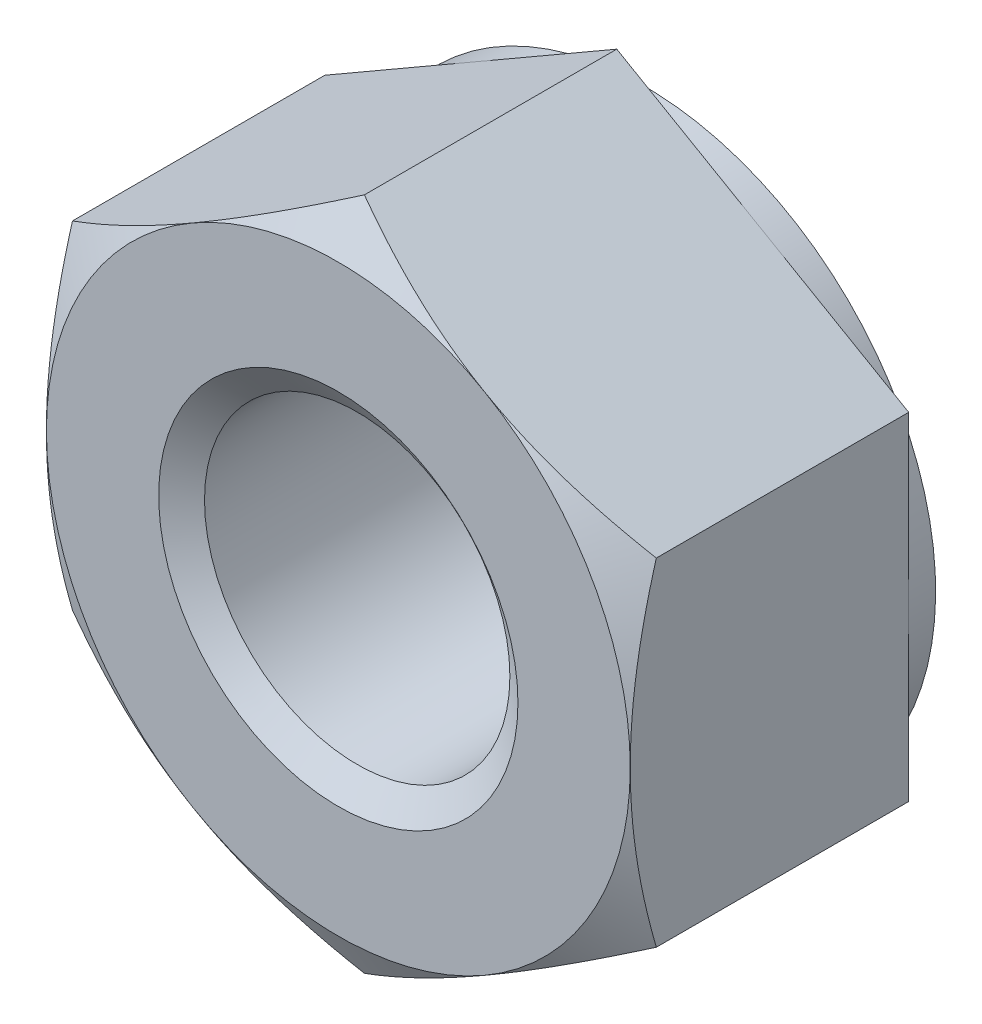
ISO-10303-21;
HEADER;
FILE_DESCRIPTION(('STEP AP214'),'2;1');
FILE_NAME('part.step','',(''),(''),'','','');
FILE_SCHEMA(('AUTOMOTIVE_DESIGN { 1 0 10303 214 1 1 1 1 }'));
ENDSEC;
DATA;
#1=APPLICATION_CONTEXT('core data for automotive mechanical design processes');
#2=APPLICATION_PROTOCOL_DEFINITION('international standard','automotive_design',2000,#1);
#3=PRODUCT_CONTEXT('',#1,'mechanical');
#4=PRODUCT('Part','Part','',(#3));
#5=PRODUCT_RELATED_PRODUCT_CATEGORY('part','',(#4));
#6=PRODUCT_DEFINITION_FORMATION('','',#4);
#7=PRODUCT_DEFINITION_CONTEXT('part definition',#1,'design');
#8=PRODUCT_DEFINITION('design','',#6,#7);
#9=PRODUCT_DEFINITION_SHAPE('','',#8);
#10=(LENGTH_UNIT() NAMED_UNIT(*) SI_UNIT(.MILLI.,.METRE.));
#11=(NAMED_UNIT(*) PLANE_ANGLE_UNIT() SI_UNIT($,.RADIAN.));
#12=(NAMED_UNIT(*) SI_UNIT($,.STERADIAN.) SOLID_ANGLE_UNIT());
#13=UNCERTAINTY_MEASURE_WITH_UNIT(LENGTH_MEASURE(1.E-05),#10,'distance_accuracy_value','');
#14=(GEOMETRIC_REPRESENTATION_CONTEXT(3) GLOBAL_UNCERTAINTY_ASSIGNED_CONTEXT((#13)) GLOBAL_UNIT_ASSIGNED_CONTEXT((#10,
#11,#12)) REPRESENTATION_CONTEXT('',''));
#15=CARTESIAN_POINT('',(0.,0.,0.));
#16=DIRECTION('',(0.,0.,1.));
#17=DIRECTION('',(1.,0.,0.));
#18=AXIS2_PLACEMENT_3D('',#15,#16,#17);
#19=CARTESIAN_POINT('',(0.,0.,0.));
#20=DIRECTION('',(0.,0.,-1.));
#21=DIRECTION('',(-1.,0.,0.));
#22=AXIS2_PLACEMENT_3D('',#19,#20,#21);
#23=CONICAL_SURFACE('',#22,6.5,1.04719755107477);
#24=CARTESIAN_POINT('',(4.72863531421646E-10,7.50555349906876,-0.580556583193494));
#25=CARTESIAN_POINT('',(0.264548615546439,7.35281628474972,-0.492351588834491));
#26=CARTESIAN_POINT('',(0.5312158310392,7.1988558960428,-0.411540414424662));
#27=CARTESIAN_POINT('',(1.06690090720306,6.88957797311685,-0.269031363292441));
#28=CARTESIAN_POINT('',(1.33590008269548,6.73427122679019,-0.207238975469958));
#29=CARTESIAN_POINT('',(1.74193754529687,6.49984538851051,-0.131368414223829));
#30=CARTESIAN_POINT('',(1.87779627836775,6.4214073124135,-0.108872020403068));
#31=CARTESIAN_POINT('',(2.15016415564433,6.26415564517842,-0.0699302937485192));
#32=CARTESIAN_POINT('',(2.28667328263536,6.18534206397925,-0.0534848016504085));
#33=CARTESIAN_POINT('',(2.56084687811666,6.02704786485477,-0.026933825458331));
#34=CARTESIAN_POINT('',(2.69851370632447,5.94756588454591,-0.016860583005697));
#35=CARTESIAN_POINT('',(2.97411810880389,5.78844560861542,-0.00337972757347202));
#36=CARTESIAN_POINT('',(3.11205573128343,5.70880728516091,2.65652992963238E-05));
#37=CARTESIAN_POINT('',(3.24999999900629,5.62916512507372,4.94253992282222E-11));
#38=B_SPLINE_CURVE_WITH_KNOTS('',3,(#24,#25,#26,#27,#28,#29,#30,#31,#32,#33,#34,#35,#36,#37),
.UNSPECIFIED.,.F.,.F.,(4,2,2,2,2,2,4),(0.,0.954247655457721,1.90367376124825,2.37900973690727,
2.8543332004677,3.33204281471727,3.80984700954534),.UNSPECIFIED.);
#39=CARTESIAN_POINT('',(0.,7.50555349878662,-0.580556583372366));
#40=VERTEX_POINT('',#39);
#41=CARTESIAN_POINT('',(3.24999999863401,5.62916512533808,0.));
#42=VERTEX_POINT('',#41);
#43=EDGE_CURVE('E20',#40,#42,#38,.T.);
#44=ORIENTED_EDGE('',*,*,#43,.F.);
#45=CARTESIAN_POINT('',(-3.2499999998115,5.62916512452829,9.15524602655434E-12));
#46=CARTESIAN_POINT('',(-3.11205573207291,5.70880728467641,2.65652986998172E-05));
#47=CARTESIAN_POINT('',(-2.97411810956437,5.78844560816871,-0.00337972755170862));
#48=CARTESIAN_POINT('',(-2.69851370701593,5.94756588415433,-0.0168605829565167));
#49=CARTESIAN_POINT('',(-2.56084687876808,6.02704786448052,-0.0269338254040609));
#50=CARTESIAN_POINT('',(-2.2866732832117,6.18534206364465,-0.0534848015858089));
#51=CARTESIAN_POINT('',(-2.15016415618561,6.26415564486611,-0.0699302936786051));
#52=CARTESIAN_POINT('',(-1.87779627883712,6.42140731214231,-0.108872020328481));
#53=CARTESIAN_POINT('',(-1.7419375457294,6.49984538825814,-0.131368414149898));
#54=CARTESIAN_POINT('',(-1.33590008302143,6.73427122660728,-0.207238975395306));
#55=CARTESIAN_POINT('',(-1.06690090746457,6.88957797299671,-0.269031363213585));
#56=CARTESIAN_POINT('',(-0.531215831135039,7.19885589595647,-0.411540414408486));
#57=CARTESIAN_POINT('',(-0.264548615540918,7.35281628463394,-0.492351588885751));
#58=CARTESIAN_POINT('',(-3.24874070537208E-10,7.50555349881243,-0.580556583387272));
#59=B_SPLINE_CURVE_WITH_KNOTS('',3,(#45,#46,#47,#48,#49,#50,#51,#52,#53,#54,#55,#56,#57,#58),
.UNSPECIFIED.,.F.,.F.,(4,2,2,2,2,2,4),(0.,0.47780419495855,0.955513809336461,1.43083727301903,
1.90617324880125,2.8555993548429,3.80984701056299),.UNSPECIFIED.);
#60=CARTESIAN_POINT('',(-3.25000000029403,5.62916512437967,0.));
#61=VERTEX_POINT('',#60);
#62=EDGE_CURVE('E107',#61,#40,#59,.T.);
#63=ORIENTED_EDGE('',*,*,#62,.F.);
#64=CARTESIAN_POINT('',(0.,0.,0.));
#65=DIRECTION('',(0.,0.,-1.));
#66=DIRECTION('',(-1.,0.,0.));
#67=AXIS2_PLACEMENT_3D('',#64,#65,#66);
#68=CIRCLE('',#67,6.5);
#69=EDGE_CURVE('E123',#61,#42,#68,.T.);
#70=ORIENTED_EDGE('',*,*,#69,.T.);
#71=EDGE_LOOP('',(#44,#63,#70));
#72=FACE_BOUND('',#71,.T.);
#73=ADVANCED_FACE('F16',(#72),#23,.T.);
#74=CARTESIAN_POINT('',(0.,0.,0.));
#75=DIRECTION('',(0.,0.,-1.));
#76=DIRECTION('',(-1.,0.,0.));
#77=AXIS2_PLACEMENT_3D('',#74,#75,#76);
#78=CONICAL_SURFACE('',#77,6.5,1.04719755107477);
#79=CARTESIAN_POINT('',(6.5,-6.66585222058023E-10,0.));
#80=CARTESIAN_POINT('',(6.5,0.159284319627088,2.65652672481863E-05));
#81=CARTESIAN_POINT('',(6.5,0.318560966655202,-0.00337972759246635));
#82=CARTESIAN_POINT('',(6.5,0.636801518754078,-0.0168605830067705));
#83=CARTESIAN_POINT('',(6.5,0.795765479490584,-0.0269338254545169));
#84=CARTESIAN_POINT('',(6.5,1.11235387797528,-0.0534848016443852));
#85=CARTESIAN_POINT('',(6.5,1.26998104049059,-0.0699302937450579));
#86=CARTESIAN_POINT('',(6.5,1.58448437518977,-0.108872020413472));
#87=CARTESIAN_POINT('',(6.5,1.74136052749585,-0.131368414245547));
#88=CARTESIAN_POINT('',(6.5,2.21021220441574,-0.207238975528109));
#89=CARTESIAN_POINT('',(6.5,2.52082569733984,-0.269031363378032));
#90=CARTESIAN_POINT('',(6.5,3.1393815435474,-0.411540414645797));
#91=CARTESIAN_POINT('',(6.5,3.4473023210451,-0.49235158916435));
#92=CARTESIAN_POINT('',(6.5,3.75277674954389,-0.580556583709641));
#93=B_SPLINE_CURVE_WITH_KNOTS('',3,(#79,#80,#81,#82,#83,#84,#85,#86,#87,#88,#89,#90,#91,#92),
.UNSPECIFIED.,.F.,.F.,(4,2,2,2,2,2,4),(0.,0.477804195114805,0.955513809649688,1.43083727348822,
1.90617324942611,2.85559935578021,3.80984701181537),.UNSPECIFIED.);
#94=CARTESIAN_POINT('',(6.5,-1.33317084205972E-09,0.));
#95=VERTEX_POINT('',#94);
#96=CARTESIAN_POINT('',(6.49999999977531,3.75277675012972,-0.580556583766414));
#97=VERTEX_POINT('',#96);
#98=EDGE_CURVE('E362',#95,#97,#93,.T.);
#99=ORIENTED_EDGE('',*,*,#98,.T.);
#100=CARTESIAN_POINT('',(3.24999999898149,5.6291651250075,9.15580939452926E-12));
#101=CARTESIAN_POINT('',(3.38794426681133,5.54952296490994,2.65653003698925E-05));
#102=CARTESIAN_POINT('',(3.52588188938477,5.46988464142251,-0.0033797275507208));
#103=CARTESIAN_POINT('',(3.80148629203953,5.31076436540649,-0.0168605829613687));
#104=CARTESIAN_POINT('',(3.93915312032881,5.23128238504503,-0.0269338254140679));
#105=CARTESIAN_POINT('',(4.2133267159733,5.07298818582176,-0.0534848016103036));
#106=CARTESIAN_POINT('',(4.34983584304605,4.99417460457635,-0.0699302937123955));
#107=CARTESIAN_POINT('',(4.62220372048568,4.8369229372498,-0.108872020384617));
#108=CARTESIAN_POINT('',(4.7580624536379,4.75848486110756,-0.131368414219083));
#109=CARTESIAN_POINT('',(5.16409991647828,4.52405902268074,-0.207238975508414));
#110=CARTESIAN_POINT('',(5.43309909212247,4.3687522762413,-0.269031363362396));
#111=CARTESIAN_POINT('',(5.96878416862515,4.0594743531824,-0.411540414638041));
#112=CARTESIAN_POINT('',(6.23545138430506,3.90551396445582,-0.492351589160441));
#113=CARTESIAN_POINT('',(6.49999999960499,3.75277675022806,-0.580556583709641));
#114=B_SPLINE_CURVE_WITH_KNOTS('',3,(#100,#101,#102,#103,#104,#105,#106,#107,#108,#109,#110,
#111,#112,#113),.UNSPECIFIED.,.F.,.F.,(4,2,2,2,2,2,4),(0.,0.477804195119742,0.955513809658695,
1.43083727350033,1.90617324944163,2.85559935579982,3.80984701184049),.UNSPECIFIED.);
#115=EDGE_CURVE('E126',#42,#97,#114,.T.);
#116=ORIENTED_EDGE('',*,*,#115,.F.);
#117=CARTESIAN_POINT('',(0.,0.,0.));
#118=DIRECTION('',(0.,0.,-1.));
#119=DIRECTION('',(-1.,0.,0.));
#120=AXIS2_PLACEMENT_3D('',#117,#118,#119);
#121=CIRCLE('',#120,6.5);
#122=EDGE_CURVE('E197',#42,#95,#121,.T.);
#123=ORIENTED_EDGE('',*,*,#122,.T.);
#124=EDGE_LOOP('',(#99,#116,#123));
#125=FACE_BOUND('',#124,.T.);
#126=ADVANCED_FACE('F373',(#125),#78,.T.);
#127=CARTESIAN_POINT('',(0.,0.,0.));
#128=DIRECTION('',(0.,0.,-1.));
#129=DIRECTION('',(-1.,0.,0.));
#130=AXIS2_PLACEMENT_3D('',#127,#128,#129);
#131=CONICAL_SURFACE('',#130,6.5,1.04719755107477);
#132=CARTESIAN_POINT('',(0.,0.,0.));
#133=DIRECTION('',(0.,0.,-1.));
#134=DIRECTION('',(-1.,0.,0.));
#135=AXIS2_PLACEMENT_3D('',#132,#133,#134);
#136=CIRCLE('',#135,6.5);
#137=CARTESIAN_POINT('',(3.24999999913947,-5.62916512504625,0.));
#138=VERTEX_POINT('',#137);
#139=EDGE_CURVE('E194',#95,#138,#136,.T.);
#140=ORIENTED_EDGE('',*,*,#139,.T.);
#141=CARTESIAN_POINT('',(6.49999999978493,-3.75277675053972,-0.580556583474029));
#142=CARTESIAN_POINT('',(6.23545138436271,-3.90551396456727,-0.4923515890777));
#143=CARTESIAN_POINT('',(5.96878416865135,-4.05947435320501,-0.411540414620386));
#144=CARTESIAN_POINT('',(5.4330990921604,-4.36875227618186,-0.26903136339699));
#145=CARTESIAN_POINT('',(5.16409991655898,-4.52405902262764,-0.207238975530734));
#146=CARTESIAN_POINT('',(4.75806245376185,-4.75848486103925,-0.131368414238618));
#147=CARTESIAN_POINT('',(4.62220372062005,-4.83692293717259,-0.108872020405778));
#148=CARTESIAN_POINT('',(4.34983584320351,-4.99417460448508,-0.0699302937329592));
#149=CARTESIAN_POINT('',(4.21332671614346,-5.07298818572532,-0.0534848016286592));
#150=CARTESIAN_POINT('',(3.93915312052231,-5.23128238493151,-0.0269338254309245));
#151=CARTESIAN_POINT('',(3.80148629224366,-5.31076436528102,-0.0168605829788777));
#152=CARTESIAN_POINT('',(3.52588188962263,-5.46988464129279,-0.00337972755480697));
#153=CARTESIAN_POINT('',(3.38794426707229,-5.54952296478793,2.65653103948823E-05));
#154=CARTESIAN_POINT('',(3.24999999927916,-5.62916512491618,4.94256495671794E-11));
#155=B_SPLINE_CURVE_WITH_KNOTS('',3,(#141,#142,#143,#144,#145,#146,#147,#148,#149,#150,#151,
#152,#153,#154),.UNSPECIFIED.,.F.,.F.,(4,2,2,2,2,2,4),(0.,0.954247655941806,1.90367376221062,
2.3790097381109,2.85433320191272,3.33204281640647,3.80984701147863),.UNSPECIFIED.);
#156=CARTESIAN_POINT('',(6.5,-3.75277674974055,-0.580556583766414));
#157=VERTEX_POINT('',#156);
#158=EDGE_CURVE('E209',#157,#138,#155,.T.);
#159=ORIENTED_EDGE('',*,*,#158,.F.);
#160=CARTESIAN_POINT('',(6.50000000035988,-3.75277674954389,-0.580556583474028));
#161=CARTESIAN_POINT('',(6.50000000012571,-3.44730232112239,-0.492351589105453));
#162=CARTESIAN_POINT('',(6.50000000003286,-3.13938154372647,-0.411540414672083));
#163=CARTESIAN_POINT('',(6.49999999996731,-2.52082569774051,-0.269031363485257));
#164=CARTESIAN_POINT('',(6.49999999999401,-2.21021220493605,-0.207238975631746));
#165=CARTESIAN_POINT('',(6.500000000003,-1.74136052819076,-0.131368414348256));
#166=CARTESIAN_POINT('',(6.50000000000081,-1.58448437594133,-0.108872020516548));
#167=CARTESIAN_POINT('',(6.49999999999919,-1.2699810413558,-0.0699302938421731));
#168=CARTESIAN_POINT('',(6.49999999999977,-1.11235387889749,-0.0534848017351855));
#169=CARTESIAN_POINT('',(6.50000000000023,-0.795765480528815,-0.0269338255280878));
#170=CARTESIAN_POINT('',(6.50000000000012,-0.636801519851326,-0.0168605830693242));
#171=CARTESIAN_POINT('',(6.49999999999988,-0.318560967870554,-0.00337972762777078));
#172=CARTESIAN_POINT('',(6.49999999999977,-0.159284320901526,2.6565248198344E-05));
#173=CARTESIAN_POINT('',(6.5,-6.66584706543692E-10,0.));
#174=B_SPLINE_CURVE_WITH_KNOTS('',3,(#160,#161,#162,#163,#164,#165,#166,#167,#168,#169,#170,
#171,#172,#173),.UNSPECIFIED.,.F.,.F.,(4,2,2,2,2,2,4),(0.,0.954247655676356,1.90367376168427,
2.37900973745345,2.85433320112418,3.33204281548458,3.80984701042333),.UNSPECIFIED.);
#175=EDGE_CURVE('E360',#157,#95,#174,.T.);
#176=ORIENTED_EDGE('',*,*,#175,.T.);
#177=EDGE_LOOP('',(#140,#159,#176));
#178=FACE_BOUND('',#177,.T.);
#179=ADVANCED_FACE('F376',(#178),#131,.T.);
#180=CARTESIAN_POINT('',(0.,0.,0.));
#181=DIRECTION('',(0.,0.,-1.));
#182=DIRECTION('',(-1.,0.,0.));
#183=AXIS2_PLACEMENT_3D('',#180,#181,#182);
#184=CONICAL_SURFACE('',#183,6.5,1.04719755107477);
#185=CARTESIAN_POINT('',(-4.72863354977161E-10,-7.50555349906876,-0.580556583193494));
#186=CARTESIAN_POINT('',(-0.264548615592853,-7.35281628472292,-0.492351588818976));
#187=CARTESIAN_POINT('',(-0.531215831132874,-7.19885589598872,-0.411540414396251));
#188=CARTESIAN_POINT('',(-1.06690090739167,-6.88957797300796,-0.269031363245728));
#189=CARTESIAN_POINT('',(-1.33590008293174,-6.73427122665379,-0.207238975417761));
#190=CARTESIAN_POINT('',(-1.74193754560532,-6.49984538833243,-0.13136841417023));
#191=CARTESIAN_POINT('',(-1.87779627870043,-6.42140731222143,-0.108872020350138));
#192=CARTESIAN_POINT('',(-2.15016415602557,-6.26415564495832,-0.0699302936993767));
#193=CARTESIAN_POINT('',(-2.28667328304091,-6.1853420637451,-0.0534848016043853));
#194=CARTESIAN_POINT('',(-2.56084687857123,-6.02704786459232,-0.0269338254210813));
#195=CARTESIAN_POINT('',(-2.69851370680374,-5.94756588426921,-0.0168605829741285));
#196=CARTESIAN_POINT('',(-2.97411810933234,-5.78844560831031,-0.00337972755580105));
#197=CARTESIAN_POINT('',(-3.11205573183639,-5.70880728484166,2.65653087502397E-05));
#198=CARTESIAN_POINT('',(-3.24999999958357,-5.62916512474042,4.94255243812087E-11));
#199=B_SPLINE_CURVE_WITH_KNOTS('',3,(#185,#186,#187,#188,#189,#190,#191,#192,#193,#194,#195,
#196,#197,#198),.UNSPECIFIED.,.F.,.F.,(4,2,2,2,2,2,4),(0.,0.954247655625393,1.90367376158064,
2.3790097373224,2.85433320096558,3.33204281529936,3.80984701021167),.UNSPECIFIED.);
#200=CARTESIAN_POINT('',(0.,-7.50555349878662,-0.580556583372366));
#201=VERTEX_POINT('',#200);
#202=CARTESIAN_POINT('',(-3.24999999978857,-5.6291651246715,0.));
#203=VERTEX_POINT('',#202);
#204=EDGE_CURVE('E330',#201,#203,#199,.T.);
#205=ORIENTED_EDGE('',*,*,#204,.F.);
#206=CARTESIAN_POINT('',(3.24999999923422,-5.62916512486158,9.15524602655464E-12));
#207=CARTESIAN_POINT('',(3.11205573151995,-5.70880728499566,2.6565289246409E-05));
#208=CARTESIAN_POINT('',(2.97411810903592,-5.78844560847382,-0.00337972756937895));
#209=CARTESIAN_POINT('',(2.69851370653667,-5.94756588443104,-0.0168605829880846));
#210=CARTESIAN_POINT('',(2.56084687831351,-6.02704786474297,-0.0269338254413101));
#211=CARTESIAN_POINT('',(2.28667328280615,-6.1853420638788,-0.053484801631832));
#212=CARTESIAN_POINT('',(2.15016415580438,-6.26415564508622,-0.0699302937277478));
#213=CARTESIAN_POINT('',(1.87779627850445,-6.42140731233438,-0.108872020381412));
#214=CARTESIAN_POINT('',(1.74193754542095,-6.49984538843622,-0.131368414203497));
#215=CARTESIAN_POINT('',(1.33590008278517,-6.73427122674369,-0.207238975447504));
#216=CARTESIAN_POINT('',(1.06690090727597,-6.8895779731056,-0.269031363260299));
#217=CARTESIAN_POINT('',(0.531215831041365,-7.19885589601056,-0.411540414436897));
#218=CARTESIAN_POINT('',(0.264548615494504,-7.35281628466074,-0.492351588901266));
#219=CARTESIAN_POINT('',(3.24874030728297E-10,-7.50555349881243,-0.580556583387272));
#220=B_SPLINE_CURVE_WITH_KNOTS('',3,(#206,#207,#208,#209,#210,#211,#212,#213,#214,#215,#216,
#217,#218,#219),.UNSPECIFIED.,.F.,.F.,(4,2,2,2,2,2,4),(0.,0.477804194874306,0.955513809168008,
1.43083727276783,1.90617324846731,2.85559935434424,3.80984700989666),.UNSPECIFIED.);
#221=EDGE_CURVE('E202',#138,#201,#220,.T.);
#222=ORIENTED_EDGE('',*,*,#221,.F.);
#223=CARTESIAN_POINT('',(0.,0.,0.));
#224=DIRECTION('',(0.,0.,-1.));
#225=DIRECTION('',(-1.,0.,0.));
#226=AXIS2_PLACEMENT_3D('',#223,#224,#225);
#227=CIRCLE('',#226,6.5);
#228=EDGE_CURVE('E191',#138,#203,#227,.T.);
#229=ORIENTED_EDGE('',*,*,#228,.T.);
#230=EDGE_LOOP('',(#205,#222,#229));
#231=FACE_BOUND('',#230,.T.);
#232=ADVANCED_FACE('F215',(#231),#184,.T.);
#233=CARTESIAN_POINT('',(0.,0.,0.));
#234=DIRECTION('',(0.,0.,-1.));
#235=DIRECTION('',(-1.,0.,0.));
#236=AXIS2_PLACEMENT_3D('',#233,#234,#235);
#237=CONICAL_SURFACE('',#236,6.5,1.04719755107477);
#238=CARTESIAN_POINT('',(-6.50000000035988,-3.75277674954389,-0.580556583474029));
#239=CARTESIAN_POINT('',(-6.50000000012571,-3.44730232108053,-0.492351589093334));
#240=CARTESIAN_POINT('',(-6.50000000003286,-3.13938154364198,-0.411540414649891));
#241=CARTESIAN_POINT('',(-6.49999999996731,-2.5208256975704,-0.269031363448769));
#242=CARTESIAN_POINT('',(-6.49999999999401,-2.21021220472296,-0.207238975590974));
#243=CARTESIAN_POINT('',(-6.500000000003,-1.74136052791256,-0.131368414306389));
#244=CARTESIAN_POINT('',(-6.50000000000081,-1.58448437564127,-0.108872020475203));
#245=CARTESIAN_POINT('',(-6.49999999999919,-1.26998104101195,-0.0699302938037879));
#246=CARTESIAN_POINT('',(-6.49999999999977,-1.11235387853171,-0.053484801699237));
#247=CARTESIAN_POINT('',(-6.50000000000023,-0.795765480118822,-0.0269338254989925));
#248=CARTESIAN_POINT('',(-6.50000000000012,-0.636801519419062,-0.0168605830446663));
#249=CARTESIAN_POINT('',(-6.49999999999988,-0.31856096739392,-0.0033797276139679));
#250=CARTESIAN_POINT('',(-6.49999999999977,-0.159284320402793,2.6565255582973E-05));
#251=CARTESIAN_POINT('',(-6.5,-1.45914148160893E-10,0.));
#252=B_SPLINE_CURVE_WITH_KNOTS('',3,(#238,#239,#240,#241,#242,#243,#244,#245,#246,#247,#248,
#249,#250,#251),.UNSPECIFIED.,.F.,.F.,(4,2,2,2,2,2,4),(0.,0.954247655807325,1.9036737619439,
2.37900973777771,2.85433320151308,3.33204281593925,3.8098470109438),.UNSPECIFIED.);
#253=CARTESIAN_POINT('',(-6.49999999977531,-3.75277674987028,-0.580556583691517));
#254=VERTEX_POINT('',#253);
#255=CARTESIAN_POINT('',(-6.5,-5.83658584786765E-10,0.));
#256=VERTEX_POINT('',#255);
#257=EDGE_CURVE('E131',#254,#256,#252,.T.);
#258=ORIENTED_EDGE('',*,*,#257,.F.);
#259=CARTESIAN_POINT('',(-3.24999999955877,-5.62916512467421,9.15579374541883E-12));
#260=CARTESIAN_POINT('',(-3.38794426736429,-5.54952296459069,2.65652909161194E-05));
#261=CARTESIAN_POINT('',(-3.52588188991322,-5.4698846411174,-0.00337972756839158));
#262=CARTESIAN_POINT('',(-3.8014862925188,-5.31076436512979,-0.0168605829929369));
#263=CARTESIAN_POINT('',(-3.93915312078338,-5.23128238478259,-0.0269338254513173));
#264=CARTESIAN_POINT('',(-4.21332671637886,-5.07298818558761,-0.0534848016563266));
#265=CARTESIAN_POINT('',(-4.34983584342728,-4.99417460435625,-0.0699302937615379));
#266=CARTESIAN_POINT('',(-4.62220372081836,-4.83692293705773,-0.108872020437547));
#267=CARTESIAN_POINT('',(-4.75806245394634,-4.75848486092948,-0.131368414272682));
#268=CARTESIAN_POINT('',(-5.16409991671454,-4.52405902254433,-0.207238975560611));
#269=CARTESIAN_POINT('',(-5.43309909231108,-4.36875227613241,-0.269031363409109));
#270=CARTESIAN_POINT('',(-5.96878416871882,-4.05947435312832,-0.411540414666452));
#271=CARTESIAN_POINT('',(-6.23545138435147,-3.90551396442902,-0.492351589175955));
#272=CARTESIAN_POINT('',(-6.49999999960499,-3.75277675022806,-0.580556583709641));
#273=B_SPLINE_CURVE_WITH_KNOTS('',3,(#259,#260,#261,#262,#263,#264,#265,#266,#267,#268,#269,
#270,#271,#272),.UNSPECIFIED.,.F.,.F.,(4,2,2,2,2,2,4),(0.,0.477804195035496,0.955513809490241,
1.43083727324913,1.90617324910768,2.85559935530115,3.80984701117415),.UNSPECIFIED.);
#274=EDGE_CURVE('E325',#203,#254,#273,.T.);
#275=ORIENTED_EDGE('',*,*,#274,.F.);
#276=CARTESIAN_POINT('',(0.,0.,0.));
#277=DIRECTION('',(0.,0.,-1.));
#278=DIRECTION('',(-1.,0.,0.));
#279=AXIS2_PLACEMENT_3D('',#276,#277,#278);
#280=CIRCLE('',#279,6.5);
#281=EDGE_CURVE('E188',#203,#256,#280,.T.);
#282=ORIENTED_EDGE('',*,*,#281,.T.);
#283=EDGE_LOOP('',(#258,#275,#282));
#284=FACE_BOUND('',#283,.T.);
#285=ADVANCED_FACE('F285',(#284),#237,.T.);
#286=CARTESIAN_POINT('',(0.,0.,0.));
#287=DIRECTION('',(0.,0.,-1.));
#288=DIRECTION('',(-1.,0.,0.));
#289=AXIS2_PLACEMENT_3D('',#286,#287,#288);
#290=CONICAL_SURFACE('',#289,6.5,1.04719755107477);
#291=CARTESIAN_POINT('',(0.,0.,0.));
#292=DIRECTION('',(0.,0.,-1.));
#293=DIRECTION('',(-1.,0.,0.));
#294=AXIS2_PLACEMENT_3D('',#291,#292,#293);
#295=CIRCLE('',#294,6.5);
#296=EDGE_CURVE('E186',#256,#61,#295,.T.);
#297=ORIENTED_EDGE('',*,*,#296,.T.);
#298=CARTESIAN_POINT('',(-6.49999999978493,3.75277675053972,-0.580556583474029));
#299=CARTESIAN_POINT('',(-6.23545138440913,3.90551396454047,-0.492351589093215));
#300=CARTESIAN_POINT('',(-5.96878416874502,4.05947435315093,-0.411540414648797));
#301=CARTESIAN_POINT('',(-5.433099092349,4.36875227607297,-0.269031363443702));
#302=CARTESIAN_POINT('',(-5.16409991679524,4.52405902249124,-0.207238975582931));
#303=CARTESIAN_POINT('',(-4.7580624540703,4.75848486086117,-0.131368414292217));
#304=CARTESIAN_POINT('',(-4.62220372095273,4.83692293698052,-0.108872020458709));
#305=CARTESIAN_POINT('',(-4.34983584358475,4.99417460426497,-0.0699302937821022));
#306=CARTESIAN_POINT('',(-4.21332671654902,5.07298818549117,-0.0534848016746825));
#307=CARTESIAN_POINT('',(-3.93915312097688,5.23128238466907,-0.0269338254681736));
#308=CARTESIAN_POINT('',(-3.80148629272292,5.31076436500432,-0.0168605830104455));
#309=CARTESIAN_POINT('',(-3.52588189015108,5.46988464098769,-0.00337972757247742));
#310=CARTESIAN_POINT('',(-3.38794426762525,5.54952296446867,2.65653009412535E-05));
#311=CARTESIAN_POINT('',(-3.24999999985644,5.62916512458288,4.94255244141925E-11));
#312=B_SPLINE_CURVE_WITH_KNOTS('',3,(#298,#299,#300,#301,#302,#303,#304,#305,#306,#307,#308,
#309,#310,#311),.UNSPECIFIED.,.F.,.F.,(4,2,2,2,2,2,4),(0.,0.954247655774136,1.90367376187823,
2.37900973769576,2.85433320141484,3.33204281582437,3.80984701081229),.UNSPECIFIED.);
#313=CARTESIAN_POINT('',(-6.49999999977531,3.75277674987028,-0.580556583691517));
#314=VERTEX_POINT('',#313);
#315=EDGE_CURVE('E116',#314,#61,#312,.T.);
#316=ORIENTED_EDGE('',*,*,#315,.F.);
#317=CARTESIAN_POINT('',(-6.5,-1.45914845209078E-10,0.));
#318=CARTESIAN_POINT('',(-6.5,0.15928432012582,2.65652598646156E-05));
#319=CARTESIAN_POINT('',(-6.5,0.318560967131836,-0.00337972760626833));
#320=CARTESIAN_POINT('',(-6.5,0.636801519186342,-0.0168605830314283));
#321=CARTESIAN_POINT('',(-6.5,0.795765479900577,-0.0269338254836127));
#322=CARTESIAN_POINT('',(-6.5,1.11235387834106,-0.053484801680334));
#323=CARTESIAN_POINT('',(-6.5,1.26998104083444,-0.0699302937834428));
#324=CARTESIAN_POINT('',(-6.5,1.58448437548983,-0.108872020454816));
#325=CARTESIAN_POINT('',(-6.5,1.74136052777405,-0.131368414287413));
#326=CARTESIAN_POINT('',(-6.5,2.21021220462883,-0.207238975568881));
#327=CARTESIAN_POINT('',(-6.5,2.52082569750995,-0.26903136341452));
#328=CARTESIAN_POINT('',(-6.5,3.13938154363189,-0.411540414667988));
#329=CARTESIAN_POINT('',(-6.5,3.44730232108696,-0.492351589176468));
#330=CARTESIAN_POINT('',(-6.5,3.75277674954389,-0.580556583709641));
#331=B_SPLINE_CURVE_WITH_KNOTS('',3,(#317,#318,#319,#320,#321,#322,#323,#324,#325,#326,#327,
#328,#329,#330),.UNSPECIFIED.,.F.,.F.,(4,2,2,2,2,2,4),(0.,0.477804195049002,0.955513809518109,
1.43083727329201,1.90617324916527,2.8555993553907,3.8098470112949),.UNSPECIFIED.);
#332=EDGE_CURVE('E133',#256,#314,#331,.T.);
#333=ORIENTED_EDGE('',*,*,#332,.F.);
#334=EDGE_LOOP('',(#297,#316,#333));
#335=FACE_BOUND('',#334,.T.);
#336=ADVANCED_FACE('F282',(#335),#290,.T.);
#337=CARTESIAN_POINT('',(6.5,3.75277675,-6.2));
#338=DIRECTION('',(0.499999999926797,0.866025403826702,0.));
#339=DIRECTION('',(-0.866025403826702,0.499999999926797,0.));
#340=AXIS2_PLACEMENT_3D('',#337,#338,#339);
#341=PLANE('',#340);
#342=DIRECTION('',(0.866025403832613,-0.49999999991656,0.));
#343=VECTOR('',#342,1.);
#344=CARTESIAN_POINT('',(3.2500000009425,5.62916512285693,-6.2));
#345=LINE('',#344,#343);
#346=CARTESIAN_POINT('',(3.24999999974734,5.62916512433911,-6.2));
#347=VERTEX_POINT('',#346);
#348=CARTESIAN_POINT('',(6.5,3.75277674947616,-6.2));
#349=VERTEX_POINT('',#348);
#350=EDGE_CURVE('E184',#347,#349,#345,.T.);
#351=ORIENTED_EDGE('',*,*,#350,.F.);
#352=DIRECTION('',(0.866025403712002,-0.500000000125464,0.));
#353=VECTOR('',#352,1.);
#354=CARTESIAN_POINT('',(0.,7.50555349928169,-6.2));
#355=LINE('',#354,#353);
#356=CARTESIAN_POINT('',(-3.04936468870781E-11,7.50555349919366,-6.2));
#357=VERTEX_POINT('',#356);
#358=EDGE_CURVE('E130',#357,#347,#355,.T.);
#359=ORIENTED_EDGE('',*,*,#358,.F.);
#360=DIRECTION('',(0.,0.,-1.));
#361=VECTOR('',#360,1.);
#362=CARTESIAN_POINT('',(0.,7.505553499,-3.0814));
#363=LINE('',#362,#361);
#364=EDGE_CURVE('E112',#40,#357,#363,.T.);
#365=ORIENTED_EDGE('',*,*,#364,.F.);
#366=ORIENTED_EDGE('',*,*,#43,.T.);
#367=ORIENTED_EDGE('',*,*,#115,.T.);
#368=DIRECTION('',(0.,0.,-1.));
#369=VECTOR('',#368,1.);
#370=CARTESIAN_POINT('',(6.5,3.75277675,-3.0814));
#371=LINE('',#370,#369);
#372=EDGE_CURVE('E361',#97,#349,#371,.T.);
#373=ORIENTED_EDGE('',*,*,#372,.T.);
#374=EDGE_LOOP('',(#351,#359,#365,#366,#367,#373));
#375=FACE_BOUND('',#374,.T.);
#376=ADVANCED_FACE('F129',(#375),#341,.T.);
#377=CARTESIAN_POINT('',(0.,7.505553499,-6.2));
#378=DIRECTION('',(-0.499999999926797,0.866025403826702,0.));
#379=DIRECTION('',(-0.866025403826702,-0.499999999926797,0.));
#380=AXIS2_PLACEMENT_3D('',#377,#378,#379);
#381=PLANE('',#380);
#382=DIRECTION('',(0.866025403712002,0.500000000125464,0.));
#383=VECTOR('',#382,1.);
#384=CARTESIAN_POINT('',(-3.249999998388,5.62916512471831,-6.2));
#385=LINE('',#384,#383);
#386=CARTESIAN_POINT('',(-3.24999999936457,5.62916512436683,-6.2));
#387=VERTEX_POINT('',#386);
#388=EDGE_CURVE('E182',#387,#357,#385,.T.);
#389=ORIENTED_EDGE('',*,*,#388,.F.);
#390=DIRECTION('',(0.866025403832613,0.49999999991656,0.));
#391=VECTOR('',#390,1.);
#392=CARTESIAN_POINT('',(-6.5,3.75277674895231,-6.2));
#393=LINE('',#392,#391);
#394=CARTESIAN_POINT('',(-6.5,3.75277674947616,-6.2));
#395=VERTEX_POINT('',#394);
#396=EDGE_CURVE('E178',#395,#387,#393,.T.);
#397=ORIENTED_EDGE('',*,*,#396,.F.);
#398=DIRECTION('',(0.,0.,-1.));
#399=VECTOR('',#398,1.);
#400=CARTESIAN_POINT('',(-6.5,3.75277675,-3.0814));
#401=LINE('',#400,#399);
#402=EDGE_CURVE('E137',#314,#395,#401,.T.);
#403=ORIENTED_EDGE('',*,*,#402,.F.);
#404=ORIENTED_EDGE('',*,*,#315,.T.);
#405=ORIENTED_EDGE('',*,*,#62,.T.);
#406=ORIENTED_EDGE('',*,*,#364,.T.);
#407=EDGE_LOOP('',(#389,#397,#403,#404,#405,#406));
#408=FACE_BOUND('',#407,.T.);
#409=ADVANCED_FACE('F110',(#408),#381,.T.);
#410=CARTESIAN_POINT('',(-6.5,-3.75277675,-6.2));
#411=DIRECTION('',(-1.,0.,0.));
#412=DIRECTION('',(0.,0.,1.));
#413=AXIS2_PLACEMENT_3D('',#410,#411,#412);
#414=PLANE('',#413);
#415=DIRECTION('',(0.,1.,0.));
#416=VECTOR('',#415,1.);
#417=CARTESIAN_POINT('',(-6.5,2.814582562,-6.2));
#418=LINE('',#417,#416);
#419=CARTESIAN_POINT('',(-6.5,-1.33317230661232E-09,-6.2));
#420=VERTEX_POINT('',#419);
#421=EDGE_CURVE('E180',#420,#395,#418,.T.);
#422=ORIENTED_EDGE('',*,*,#421,.F.);
#423=DIRECTION('',(0.,1.,0.));
#424=VECTOR('',#423,1.);
#425=CARTESIAN_POINT('',(-6.5,-2.814582562,-6.2));
#426=LINE('',#425,#424);
#427=CARTESIAN_POINT('',(-6.5,-3.75277674947615,-6.2));
#428=VERTEX_POINT('',#427);
#429=EDGE_CURVE('E177',#428,#420,#426,.T.);
#430=ORIENTED_EDGE('',*,*,#429,.F.);
#431=DIRECTION('',(0.,0.,-1.));
#432=VECTOR('',#431,1.);
#433=CARTESIAN_POINT('',(-6.5,-3.75277675,-3.0814));
#434=LINE('',#433,#432);
#435=EDGE_CURVE('E336',#254,#428,#434,.T.);
#436=ORIENTED_EDGE('',*,*,#435,.F.);
#437=ORIENTED_EDGE('',*,*,#257,.T.);
#438=ORIENTED_EDGE('',*,*,#332,.T.);
#439=ORIENTED_EDGE('',*,*,#402,.T.);
#440=EDGE_LOOP('',(#422,#430,#436,#437,#438,#439));
#441=FACE_BOUND('',#440,.T.);
#442=ADVANCED_FACE('F309',(#441),#414,.T.);
#443=CARTESIAN_POINT('',(-6.5,-3.75277675,-6.2));
#444=DIRECTION('',(-0.499999999926797,-0.866025403826702,0.));
#445=DIRECTION('',(0.866025403826702,-0.499999999926797,0.));
#446=AXIS2_PLACEMENT_3D('',#443,#444,#445);
#447=PLANE('',#446);
#448=DIRECTION('',(-0.866025403832613,0.49999999991656,0.));
#449=VECTOR('',#448,1.);
#450=CARTESIAN_POINT('',(-3.2500000009425,-5.62916512285693,-6.2));
#451=LINE('',#450,#449);
#452=CARTESIAN_POINT('',(-3.2499999996309,-5.62916512440633,-6.2));
#453=VERTEX_POINT('',#452);
#454=EDGE_CURVE('E174',#453,#428,#451,.T.);
#455=ORIENTED_EDGE('',*,*,#454,.F.);
#456=DIRECTION('',(-0.866025403712002,0.500000000125464,0.));
#457=VECTOR('',#456,1.);
#458=CARTESIAN_POINT('',(0.,-7.50555349928169,-6.2));
#459=LINE('',#458,#457);
#460=CARTESIAN_POINT('',(3.04936468870781E-11,-7.50555349919366,-6.2));
#461=VERTEX_POINT('',#460);
#462=EDGE_CURVE('E172',#461,#453,#459,.T.);
#463=ORIENTED_EDGE('',*,*,#462,.F.);
#464=DIRECTION('',(0.,0.,-1.));
#465=VECTOR('',#464,1.);
#466=CARTESIAN_POINT('',(0.,-7.505553499,-3.0814));
#467=LINE('',#466,#465);
#468=EDGE_CURVE('E201',#201,#461,#467,.T.);
#469=ORIENTED_EDGE('',*,*,#468,.F.);
#470=ORIENTED_EDGE('',*,*,#204,.T.);
#471=ORIENTED_EDGE('',*,*,#274,.T.);
#472=ORIENTED_EDGE('',*,*,#435,.T.);
#473=EDGE_LOOP('',(#455,#463,#469,#470,#471,#472));
#474=FACE_BOUND('',#473,.T.);
#475=ADVANCED_FACE('F314',(#474),#447,.T.);
#476=CARTESIAN_POINT('',(6.5,-3.75277675,-6.2));
#477=DIRECTION('',(-1.,0.,0.));
#478=DIRECTION('',(0.,0.,1.));
#479=AXIS2_PLACEMENT_3D('',#476,#477,#478);
#480=PLANE('',#479);
#481=DIRECTION('',(0.,0.,1.));
#482=VECTOR('',#481,1.);
#483=CARTESIAN_POINT('',(6.5,-3.75277675,-3.0814));
#484=LINE('',#483,#482);
#485=CARTESIAN_POINT('',(6.5,-3.75277674947615,-6.2));
#486=VERTEX_POINT('',#485);
#487=EDGE_CURVE('E357',#486,#157,#484,.T.);
#488=ORIENTED_EDGE('',*,*,#487,.F.);
#489=DIRECTION('',(0.,-1.,0.));
#490=VECTOR('',#489,1.);
#491=CARTESIAN_POINT('',(6.5,-2.814582562,-6.2));
#492=LINE('',#491,#490);
#493=CARTESIAN_POINT('',(6.5,-1.21244680000612E-11,-6.2));
#494=VERTEX_POINT('',#493);
#495=EDGE_CURVE('E168',#494,#486,#492,.T.);
#496=ORIENTED_EDGE('',*,*,#495,.F.);
#497=DIRECTION('',(0.,-1.,0.));
#498=VECTOR('',#497,1.);
#499=CARTESIAN_POINT('',(6.5,2.814582562,-6.2));
#500=LINE('',#499,#498);
#501=EDGE_CURVE('E40',#349,#494,#500,.T.);
#502=ORIENTED_EDGE('',*,*,#501,.F.);
#503=ORIENTED_EDGE('',*,*,#372,.F.);
#504=ORIENTED_EDGE('',*,*,#98,.F.);
#505=ORIENTED_EDGE('',*,*,#175,.F.);
#506=EDGE_LOOP('',(#488,#496,#502,#503,#504,#505));
#507=FACE_BOUND('',#506,.T.);
#508=ADVANCED_FACE('F224',(#507),#480,.F.);
#509=CARTESIAN_POINT('',(0.,-7.505553499,-6.2));
#510=DIRECTION('',(0.499999999926797,-0.866025403826702,0.));
#511=DIRECTION('',(0.866025403826702,0.499999999926797,0.));
#512=AXIS2_PLACEMENT_3D('',#509,#510,#511);
#513=PLANE('',#512);
#514=DIRECTION('',(-0.866025403712002,-0.500000000125464,0.));
#515=VECTOR('',#514,1.);
#516=CARTESIAN_POINT('',(3.249999998388,-5.62916512471831,-6.2));
#517=LINE('',#516,#515);
#518=CARTESIAN_POINT('',(3.24999999994075,-5.6291651234353,-6.2));
#519=VERTEX_POINT('',#518);
#520=EDGE_CURVE('E169',#519,#461,#517,.T.);
#521=ORIENTED_EDGE('',*,*,#520,.F.);
#522=DIRECTION('',(-0.866025403832613,-0.49999999991656,0.));
#523=VECTOR('',#522,1.);
#524=CARTESIAN_POINT('',(6.5,-3.75277674895231,-6.2));
#525=LINE('',#524,#523);
#526=EDGE_CURVE('E166',#486,#519,#525,.T.);
#527=ORIENTED_EDGE('',*,*,#526,.F.);
#528=ORIENTED_EDGE('',*,*,#487,.T.);
#529=ORIENTED_EDGE('',*,*,#158,.T.);
#530=ORIENTED_EDGE('',*,*,#221,.T.);
#531=ORIENTED_EDGE('',*,*,#468,.T.);
#532=EDGE_LOOP('',(#521,#527,#528,#529,#530,#531));
#533=FACE_BOUND('',#532,.T.);
#534=ADVANCED_FACE('F218',(#533),#513,.T.);
#535=CARTESIAN_POINT('',(6.578,-6.578,0.));
#536=DIRECTION('',(0.,0.,-1.));
#537=DIRECTION('',(-1.,0.,0.));
#538=AXIS2_PLACEMENT_3D('',#535,#536,#537);
#539=PLANE('',#538);
#540=CARTESIAN_POINT('',(0.,0.,0.));
#541=DIRECTION('',(0.,0.,1.));
#542=DIRECTION('',(1.,0.,0.));
#543=AXIS2_PLACEMENT_3D('',#540,#541,#542);
#544=CIRCLE('',#543,4.);
#545=CARTESIAN_POINT('',(4.,0.,0.));
#546=VERTEX_POINT('',#545);
#547=EDGE_CURVE('E163',#546,#546,#544,.T.);
#548=ORIENTED_EDGE('',*,*,#547,.F.);
#549=EDGE_LOOP('',(#548));
#550=FACE_BOUND('',#549,.T.);
#551=ORIENTED_EDGE('',*,*,#281,.F.);
#552=ORIENTED_EDGE('',*,*,#228,.F.);
#553=ORIENTED_EDGE('',*,*,#139,.F.);
#554=ORIENTED_EDGE('',*,*,#122,.F.);
#555=ORIENTED_EDGE('',*,*,#69,.F.);
#556=ORIENTED_EDGE('',*,*,#296,.F.);
#557=EDGE_LOOP('',(#551,#552,#553,#554,#555,#556));
#558=FACE_BOUND('',#557,.T.);
#559=ADVANCED_FACE('F223',(#550,#558),#539,.F.);
#560=CARTESIAN_POINT('',(6.5,-0.033774991,-6.2));
#561=DIRECTION('',(0.,0.,-1.));
#562=DIRECTION('',(-1.,0.,0.));
#563=AXIS2_PLACEMENT_3D('',#560,#561,#562);
#564=PLANE('',#563);
#565=CARTESIAN_POINT('',(0.,0.,-6.2));
#566=DIRECTION('',(0.,0.,1.));
#567=DIRECTION('',(0.,-1.,0.));
#568=AXIS2_PLACEMENT_3D('',#565,#566,#567);
#569=CIRCLE('',#568,6.5);
#570=EDGE_CURVE('E161',#494,#347,#569,.T.);
#571=ORIENTED_EDGE('',*,*,#570,.T.);
#572=ORIENTED_EDGE('',*,*,#350,.T.);
#573=ORIENTED_EDGE('',*,*,#501,.T.);
#574=EDGE_LOOP('',(#571,#572,#573));
#575=FACE_BOUND('',#574,.T.);
#576=ADVANCED_FACE('F231',(#575),#564,.T.);
#577=CARTESIAN_POINT('',(3.289,5.617906794,-6.2));
#578=DIRECTION('',(0.,0.,-1.));
#579=DIRECTION('',(-1.,0.,0.));
#580=AXIS2_PLACEMENT_3D('',#577,#578,#579);
#581=PLANE('',#580);
#582=ORIENTED_EDGE('',*,*,#388,.T.);
#583=ORIENTED_EDGE('',*,*,#358,.T.);
#584=CARTESIAN_POINT('',(0.,0.,-6.2));
#585=DIRECTION('',(0.,0.,1.));
#586=DIRECTION('',(0.,-1.,0.));
#587=AXIS2_PLACEMENT_3D('',#584,#585,#586);
#588=CIRCLE('',#587,6.5);
#589=EDGE_CURVE('E158',#347,#387,#588,.T.);
#590=ORIENTED_EDGE('',*,*,#589,.T.);
#591=EDGE_LOOP('',(#582,#583,#590));
#592=FACE_BOUND('',#591,.T.);
#593=ADVANCED_FACE('F235',(#592),#581,.T.);
#594=CARTESIAN_POINT('',(-3.2305,-0.033774991,-6.2));
#595=DIRECTION('',(0.,0.,-1.));
#596=DIRECTION('',(-1.,0.,0.));
#597=AXIS2_PLACEMENT_3D('',#594,#595,#596);
#598=PLANE('',#597);
#599=ORIENTED_EDGE('',*,*,#421,.T.);
#600=ORIENTED_EDGE('',*,*,#396,.T.);
#601=CARTESIAN_POINT('',(0.,0.,-6.2));
#602=DIRECTION('',(0.,0.,1.));
#603=DIRECTION('',(0.,-1.,0.));
#604=AXIS2_PLACEMENT_3D('',#601,#602,#603);
#605=CIRCLE('',#604,6.5);
#606=EDGE_CURVE('E155',#387,#420,#605,.T.);
#607=ORIENTED_EDGE('',*,*,#606,.T.);
#608=EDGE_LOOP('',(#599,#600,#607));
#609=FACE_BOUND('',#608,.T.);
#610=ADVANCED_FACE('F238',(#609),#598,.T.);
#611=CARTESIAN_POINT('',(-3.2305,-5.662940115,-6.2));
#612=DIRECTION('',(0.,0.,-1.));
#613=DIRECTION('',(-1.,0.,0.));
#614=AXIS2_PLACEMENT_3D('',#611,#612,#613);
#615=PLANE('',#614);
#616=CARTESIAN_POINT('',(0.,0.,-6.2));
#617=DIRECTION('',(0.,0.,1.));
#618=DIRECTION('',(0.,-1.,0.));
#619=AXIS2_PLACEMENT_3D('',#616,#617,#618);
#620=CIRCLE('',#619,6.5);
#621=EDGE_CURVE('E152',#420,#453,#620,.T.);
#622=ORIENTED_EDGE('',*,*,#621,.T.);
#623=ORIENTED_EDGE('',*,*,#454,.T.);
#624=ORIENTED_EDGE('',*,*,#429,.T.);
#625=EDGE_LOOP('',(#622,#623,#624));
#626=FACE_BOUND('',#625,.T.);
#627=ADVANCED_FACE('F242',(#626),#615,.T.);
#628=CARTESIAN_POINT('',(3.289,-7.51681183,-6.2));
#629=DIRECTION('',(0.,0.,-1.));
#630=DIRECTION('',(-1.,0.,0.));
#631=AXIS2_PLACEMENT_3D('',#628,#629,#630);
#632=PLANE('',#631);
#633=CARTESIAN_POINT('',(0.,0.,-6.2));
#634=DIRECTION('',(0.,0.,1.));
#635=DIRECTION('',(0.,-1.,0.));
#636=AXIS2_PLACEMENT_3D('',#633,#634,#635);
#637=CIRCLE('',#636,6.5);
#638=EDGE_CURVE('E149',#453,#519,#637,.T.);
#639=ORIENTED_EDGE('',*,*,#638,.T.);
#640=ORIENTED_EDGE('',*,*,#520,.T.);
#641=ORIENTED_EDGE('',*,*,#462,.T.);
#642=EDGE_LOOP('',(#639,#640,#641));
#643=FACE_BOUND('',#642,.T.);
#644=ADVANCED_FACE('F246',(#643),#632,.T.);
#645=CARTESIAN_POINT('',(6.5,-5.662940115,-6.2));
#646=DIRECTION('',(0.,0.,-1.));
#647=DIRECTION('',(-1.,0.,0.));
#648=AXIS2_PLACEMENT_3D('',#645,#646,#647);
#649=PLANE('',#648);
#650=ORIENTED_EDGE('',*,*,#526,.T.);
#651=CARTESIAN_POINT('',(0.,0.,-6.2));
#652=DIRECTION('',(0.,0.,1.));
#653=DIRECTION('',(0.,-1.,0.));
#654=AXIS2_PLACEMENT_3D('',#651,#652,#653);
#655=CIRCLE('',#654,6.5);
#656=EDGE_CURVE('E146',#519,#494,#655,.T.);
#657=ORIENTED_EDGE('',*,*,#656,.T.);
#658=ORIENTED_EDGE('',*,*,#495,.T.);
#659=EDGE_LOOP('',(#650,#657,#658));
#660=FACE_BOUND('',#659,.T.);
#661=ADVANCED_FACE('F249',(#660),#649,.T.);
#662=CARTESIAN_POINT('',(0.,0.,-0.420124523));
#663=DIRECTION('',(0.,0.,1.));
#664=DIRECTION('',(1.,0.,0.));
#665=AXIS2_PLACEMENT_3D('',#662,#663,#664);
#666=CONICAL_SURFACE('',#665,3.4,0.959931088513929);
#667=ORIENTED_EDGE('',*,*,#547,.T.);
#668=EDGE_LOOP('',(#667));
#669=FACE_BOUND('',#668,.T.);
#670=CARTESIAN_POINT('',(0.,0.,-0.420124523));
#671=DIRECTION('',(0.,0.,1.));
#672=DIRECTION('',(1.,0.,0.));
#673=AXIS2_PLACEMENT_3D('',#670,#671,#672);
#674=CIRCLE('',#673,3.4);
#675=CARTESIAN_POINT('',(3.4,0.,-0.420124523));
#676=VERTEX_POINT('',#675);
#677=EDGE_CURVE('E145',#676,#676,#674,.T.);
#678=ORIENTED_EDGE('',*,*,#677,.F.);
#679=EDGE_LOOP('',(#678));
#680=FACE_BOUND('',#679,.T.);
#681=ADVANCED_FACE('F252',(#669,#680),#666,.F.);
#682=CARTESIAN_POINT('',(0.,0.,-6.8));
#683=DIRECTION('',(0.,0.,1.));
#684=DIRECTION('',(0.,-1.,0.));
#685=AXIS2_PLACEMENT_3D('',#682,#683,#684);
#686=CYLINDRICAL_SURFACE('',#685,6.5);
#687=CARTESIAN_POINT('',(0.,0.,-6.8));
#688=DIRECTION('',(0.,0.,1.));
#689=DIRECTION('',(0.,-1.,0.));
#690=AXIS2_PLACEMENT_3D('',#687,#688,#689);
#691=CIRCLE('',#690,6.5);
#692=CARTESIAN_POINT('',(0.,-6.5,-6.8));
#693=VERTEX_POINT('',#692);
#694=EDGE_CURVE('E142',#693,#693,#691,.F.);
#695=ORIENTED_EDGE('',*,*,#694,.F.);
#696=EDGE_LOOP('',(#695));
#697=FACE_BOUND('',#696,.T.);
#698=ORIENTED_EDGE('',*,*,#570,.F.);
#699=ORIENTED_EDGE('',*,*,#656,.F.);
#700=ORIENTED_EDGE('',*,*,#638,.F.);
#701=ORIENTED_EDGE('',*,*,#621,.F.);
#702=ORIENTED_EDGE('',*,*,#606,.F.);
#703=ORIENTED_EDGE('',*,*,#589,.F.);
#704=EDGE_LOOP('',(#698,#699,#700,#701,#702,#703));
#705=FACE_BOUND('',#704,.T.);
#706=ADVANCED_FACE('F259',(#697,#705),#686,.T.);
#707=CARTESIAN_POINT('',(0.,0.,-6.354475477));
#708=DIRECTION('',(0.,0.,1.));
#709=DIRECTION('',(1.,0.,0.));
#710=AXIS2_PLACEMENT_3D('',#707,#708,#709);
#711=CYLINDRICAL_SURFACE('',#710,3.4);
#712=ORIENTED_EDGE('',*,*,#677,.T.);
#713=EDGE_LOOP('',(#712));
#714=FACE_BOUND('',#713,.T.);
#715=CARTESIAN_POINT('',(0.,0.,-6.35447547699997));
#716=DIRECTION('',(0.,0.,-1.));
#717=DIRECTION('',(-1.,0.,0.));
#718=AXIS2_PLACEMENT_3D('',#715,#716,#717);
#719=CIRCLE('',#718,3.4);
#720=CARTESIAN_POINT('',(-3.4,0.,-6.354475477));
#721=VERTEX_POINT('',#720);
#722=EDGE_CURVE('E141',#721,#721,#719,.F.);
#723=ORIENTED_EDGE('',*,*,#722,.F.);
#724=EDGE_LOOP('',(#723));
#725=FACE_BOUND('',#724,.T.);
#726=ADVANCED_FACE('F275',(#714,#725),#711,.F.);
#727=CARTESIAN_POINT('',(6.578,-6.578,-6.8));
#728=DIRECTION('',(0.,0.,-1.));
#729=DIRECTION('',(-1.,0.,0.));
#730=AXIS2_PLACEMENT_3D('',#727,#728,#729);
#731=PLANE('',#730);
#732=CARTESIAN_POINT('',(0.,0.,-6.8));
#733=DIRECTION('',(0.,0.,1.));
#734=DIRECTION('',(0.,-1.,0.));
#735=AXIS2_PLACEMENT_3D('',#732,#733,#734);
#736=CIRCLE('',#735,4.);
#737=CARTESIAN_POINT('',(0.,-4.,-6.8));
#738=VERTEX_POINT('',#737);
#739=EDGE_CURVE('E31',#738,#738,#736,.F.);
#740=ORIENTED_EDGE('',*,*,#739,.F.);
#741=EDGE_LOOP('',(#740));
#742=FACE_BOUND('',#741,.T.);
#743=ORIENTED_EDGE('',*,*,#694,.T.);
#744=EDGE_LOOP('',(#743));
#745=FACE_BOUND('',#744,.T.);
#746=ADVANCED_FACE('F18',(#742,#745),#731,.T.);
#747=CARTESIAN_POINT('',(0.,0.,-6.354475477));
#748=DIRECTION('',(0.,0.,-1.));
#749=DIRECTION('',(-1.,0.,0.));
#750=AXIS2_PLACEMENT_3D('',#747,#748,#749);
#751=CONICAL_SURFACE('',#750,3.4,0.959931088513927);
#752=ORIENTED_EDGE('',*,*,#722,.T.);
#753=EDGE_LOOP('',(#752));
#754=FACE_BOUND('',#753,.T.);
#755=CARTESIAN_POINT('',(0.,0.,-6.7746));
#756=DIRECTION('',(0.,0.,1.));
#757=DIRECTION('',(1.,0.,0.));
#758=AXIS2_PLACEMENT_3D('',#755,#756,#757);
#759=CIRCLE('',#758,4.);
#760=CARTESIAN_POINT('',(4.,0.,-6.7746));
#761=VERTEX_POINT('',#760);
#762=EDGE_CURVE('E11',#761,#761,#759,.T.);
#763=ORIENTED_EDGE('',*,*,#762,.F.);
#764=EDGE_LOOP('',(#763));
#765=FACE_BOUND('',#764,.T.);
#766=ADVANCED_FACE('F264',(#754,#765),#751,.F.);
#767=CARTESIAN_POINT('',(0.,0.,-6.8));
#768=DIRECTION('',(0.,0.,1.));
#769=DIRECTION('',(0.,-1.,0.));
#770=AXIS2_PLACEMENT_3D('',#767,#768,#769);
#771=CYLINDRICAL_SURFACE('',#770,4.);
#772=ORIENTED_EDGE('',*,*,#739,.T.);
#773=EDGE_LOOP('',(#772));
#774=FACE_BOUND('',#773,.T.);
#775=ORIENTED_EDGE('',*,*,#762,.T.);
#776=EDGE_LOOP('',(#775));
#777=FACE_BOUND('',#776,.T.);
#778=ADVANCED_FACE('F262',(#774,#777),#771,.F.);
#779=CLOSED_SHELL('',(#73,#126,#179,#232,#285,#336,#376,#409,#442,#475,#508,#534,#559,#576,#593,
#610,#627,#644,#661,#681,#706,#726,#746,#766,#778));
#780=MANIFOLD_SOLID_BREP('B1',#779);
#781=ADVANCED_BREP_SHAPE_REPRESENTATION('',(#18,#780),#14);
#782=SHAPE_DEFINITION_REPRESENTATION(#9,#781);
ENDSEC;
END-ISO-10303-21;
